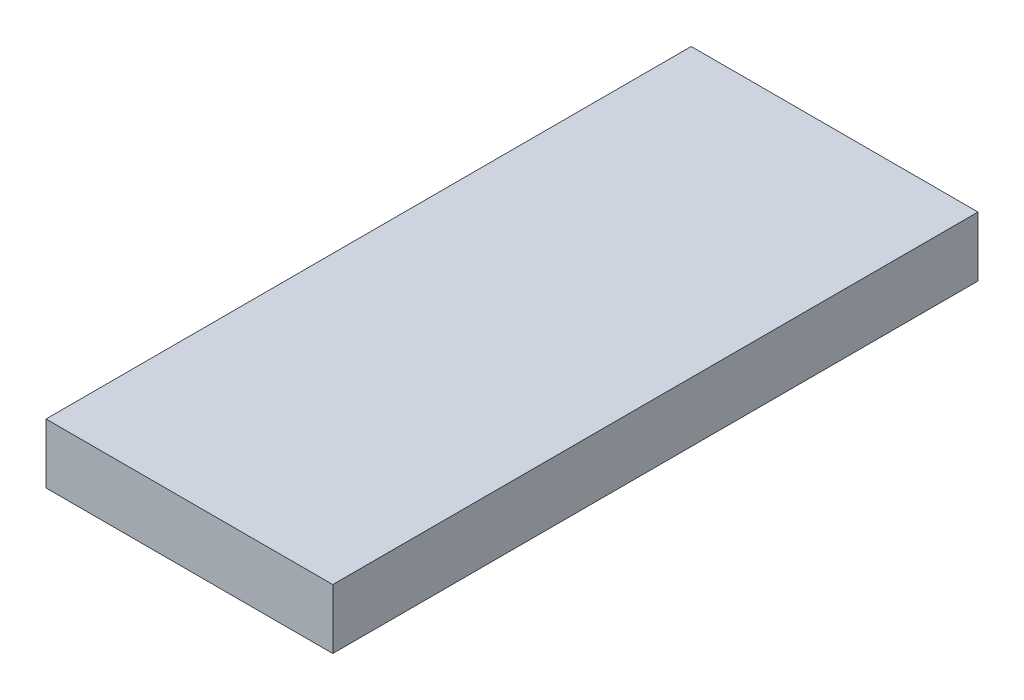
ISO-10303-21;
HEADER;
FILE_DESCRIPTION(('STEP AP214'),'2;1');
FILE_NAME('part.step','',(''),(''),'','','');
FILE_SCHEMA(('AUTOMOTIVE_DESIGN { 1 0 10303 214 1 1 1 1 }'));
ENDSEC;
DATA;
#1=APPLICATION_CONTEXT('core data for automotive mechanical design processes');
#2=APPLICATION_PROTOCOL_DEFINITION('international standard','automotive_design',2000,#1);
#3=PRODUCT_CONTEXT('',#1,'mechanical');
#4=PRODUCT('Part','Part','',(#3));
#5=PRODUCT_RELATED_PRODUCT_CATEGORY('part','',(#4));
#6=PRODUCT_DEFINITION_FORMATION('','',#4);
#7=PRODUCT_DEFINITION_CONTEXT('part definition',#1,'design');
#8=PRODUCT_DEFINITION('design','',#6,#7);
#9=PRODUCT_DEFINITION_SHAPE('','',#8);
#10=(LENGTH_UNIT() NAMED_UNIT(*) SI_UNIT(.MILLI.,.METRE.));
#11=(NAMED_UNIT(*) PLANE_ANGLE_UNIT() SI_UNIT($,.RADIAN.));
#12=(NAMED_UNIT(*) SI_UNIT($,.STERADIAN.) SOLID_ANGLE_UNIT());
#13=UNCERTAINTY_MEASURE_WITH_UNIT(LENGTH_MEASURE(1.E-05),#10,'distance_accuracy_value','');
#14=(GEOMETRIC_REPRESENTATION_CONTEXT(3) GLOBAL_UNCERTAINTY_ASSIGNED_CONTEXT((#13)) GLOBAL_UNIT_ASSIGNED_CONTEXT((#10,
#11,#12)) REPRESENTATION_CONTEXT('',''));
#15=CARTESIAN_POINT('',(0.,0.,0.));
#16=DIRECTION('',(0.,0.,1.));
#17=DIRECTION('',(1.,0.,0.));
#18=AXIS2_PLACEMENT_3D('',#15,#16,#17);
#19=CARTESIAN_POINT('',(-12.,5.,27.));
#20=DIRECTION('',(1.,0.,0.));
#21=DIRECTION('',(0.,0.,-1.));
#22=AXIS2_PLACEMENT_3D('',#19,#20,#21);
#23=PLANE('',#22);
#24=DIRECTION('',(0.,0.,1.));
#25=VECTOR('',#24,1.);
#26=CARTESIAN_POINT('',(-12.,0.,27.));
#27=LINE('',#26,#25);
#28=CARTESIAN_POINT('',(-12.,0.,-27.));
#29=VERTEX_POINT('',#28);
#30=CARTESIAN_POINT('',(-12.,0.,27.));
#31=VERTEX_POINT('',#30);
#32=EDGE_CURVE('E100',#29,#31,#27,.T.);
#33=ORIENTED_EDGE('',*,*,#32,.T.);
#34=DIRECTION('',(0.,-1.,0.));
#35=VECTOR('',#34,1.);
#36=CARTESIAN_POINT('',(-12.,5.,27.));
#37=LINE('',#36,#35);
#38=CARTESIAN_POINT('',(-12.,5.,27.));
#39=VERTEX_POINT('',#38);
#40=EDGE_CURVE('E11',#39,#31,#37,.T.);
#41=ORIENTED_EDGE('',*,*,#40,.F.);
#42=DIRECTION('',(0.,0.,1.));
#43=VECTOR('',#42,1.);
#44=CARTESIAN_POINT('',(-12.,5.,27.));
#45=LINE('',#44,#43);
#46=CARTESIAN_POINT('',(-12.,5.,-27.));
#47=VERTEX_POINT('',#46);
#48=EDGE_CURVE('E88',#47,#39,#45,.T.);
#49=ORIENTED_EDGE('',*,*,#48,.F.);
#50=DIRECTION('',(0.,-1.,0.));
#51=VECTOR('',#50,1.);
#52=CARTESIAN_POINT('',(-12.,5.,-27.));
#53=LINE('',#52,#51);
#54=EDGE_CURVE('E96',#47,#29,#53,.T.);
#55=ORIENTED_EDGE('',*,*,#54,.T.);
#56=EDGE_LOOP('',(#33,#41,#49,#55));
#57=FACE_BOUND('',#56,.T.);
#58=ADVANCED_FACE('F37',(#57),#23,.F.);
#59=CARTESIAN_POINT('',(12.,5.,27.));
#60=DIRECTION('',(0.,0.,-1.));
#61=DIRECTION('',(-1.,0.,0.));
#62=AXIS2_PLACEMENT_3D('',#59,#60,#61);
#63=PLANE('',#62);
#64=DIRECTION('',(1.,0.,0.));
#65=VECTOR('',#64,1.);
#66=CARTESIAN_POINT('',(12.,0.,27.));
#67=LINE('',#66,#65);
#68=CARTESIAN_POINT('',(12.,0.,27.));
#69=VERTEX_POINT('',#68);
#70=EDGE_CURVE('E92',#31,#69,#67,.T.);
#71=ORIENTED_EDGE('',*,*,#70,.T.);
#72=DIRECTION('',(0.,-1.,0.));
#73=VECTOR('',#72,1.);
#74=CARTESIAN_POINT('',(12.,5.,27.));
#75=LINE('',#74,#73);
#76=CARTESIAN_POINT('',(12.,5.,27.));
#77=VERTEX_POINT('',#76);
#78=EDGE_CURVE('E45',#77,#69,#75,.T.);
#79=ORIENTED_EDGE('',*,*,#78,.F.);
#80=DIRECTION('',(1.,0.,0.));
#81=VECTOR('',#80,1.);
#82=CARTESIAN_POINT('',(12.,5.,27.));
#83=LINE('',#82,#81);
#84=EDGE_CURVE('E83',#39,#77,#83,.T.);
#85=ORIENTED_EDGE('',*,*,#84,.F.);
#86=ORIENTED_EDGE('',*,*,#40,.T.);
#87=EDGE_LOOP('',(#71,#79,#85,#86));
#88=FACE_BOUND('',#87,.T.);
#89=ADVANCED_FACE('F91',(#88),#63,.F.);
#90=CARTESIAN_POINT('',(12.,5.,27.));
#91=DIRECTION('',(-1.,0.,0.));
#92=DIRECTION('',(0.,0.,1.));
#93=AXIS2_PLACEMENT_3D('',#90,#91,#92);
#94=PLANE('',#93);
#95=DIRECTION('',(0.,0.,-1.));
#96=VECTOR('',#95,1.);
#97=CARTESIAN_POINT('',(12.,0.,27.));
#98=LINE('',#97,#96);
#99=CARTESIAN_POINT('',(12.,0.,-27.));
#100=VERTEX_POINT('',#99);
#101=EDGE_CURVE('E70',#69,#100,#98,.T.);
#102=ORIENTED_EDGE('',*,*,#101,.T.);
#103=DIRECTION('',(0.,-1.,0.));
#104=VECTOR('',#103,1.);
#105=CARTESIAN_POINT('',(12.,5.,-27.));
#106=LINE('',#105,#104);
#107=CARTESIAN_POINT('',(12.,5.,-27.));
#108=VERTEX_POINT('',#107);
#109=EDGE_CURVE('E93',#108,#100,#106,.T.);
#110=ORIENTED_EDGE('',*,*,#109,.F.);
#111=DIRECTION('',(0.,0.,-1.));
#112=VECTOR('',#111,1.);
#113=CARTESIAN_POINT('',(12.,5.,27.));
#114=LINE('',#113,#112);
#115=EDGE_CURVE('E86',#77,#108,#114,.T.);
#116=ORIENTED_EDGE('',*,*,#115,.F.);
#117=ORIENTED_EDGE('',*,*,#78,.T.);
#118=EDGE_LOOP('',(#102,#110,#116,#117));
#119=FACE_BOUND('',#118,.T.);
#120=ADVANCED_FACE('F94',(#119),#94,.F.);
#121=CARTESIAN_POINT('',(12.,5.,-27.));
#122=DIRECTION('',(0.,0.,1.));
#123=DIRECTION('',(1.,0.,0.));
#124=AXIS2_PLACEMENT_3D('',#121,#122,#123);
#125=PLANE('',#124);
#126=DIRECTION('',(-1.,0.,0.));
#127=VECTOR('',#126,1.);
#128=CARTESIAN_POINT('',(12.,0.,-27.));
#129=LINE('',#128,#127);
#130=EDGE_CURVE('E76',#100,#29,#129,.T.);
#131=ORIENTED_EDGE('',*,*,#130,.T.);
#132=ORIENTED_EDGE('',*,*,#54,.F.);
#133=DIRECTION('',(-1.,0.,0.));
#134=VECTOR('',#133,1.);
#135=CARTESIAN_POINT('',(12.,5.,-27.));
#136=LINE('',#135,#134);
#137=EDGE_CURVE('E53',#108,#47,#136,.T.);
#138=ORIENTED_EDGE('',*,*,#137,.F.);
#139=ORIENTED_EDGE('',*,*,#109,.T.);
#140=EDGE_LOOP('',(#131,#132,#138,#139));
#141=FACE_BOUND('',#140,.T.);
#142=ADVANCED_FACE('F107',(#141),#125,.F.);
#143=CARTESIAN_POINT('',(0.,5.,0.));
#144=DIRECTION('',(0.,1.,0.));
#145=DIRECTION('',(0.,0.,1.));
#146=AXIS2_PLACEMENT_3D('',#143,#144,#145);
#147=PLANE('',#146);
#148=ORIENTED_EDGE('',*,*,#48,.T.);
#149=ORIENTED_EDGE('',*,*,#84,.T.);
#150=ORIENTED_EDGE('',*,*,#115,.T.);
#151=ORIENTED_EDGE('',*,*,#137,.T.);
#152=EDGE_LOOP('',(#148,#149,#150,#151));
#153=FACE_BOUND('',#152,.T.);
#154=ADVANCED_FACE('F84',(#153),#147,.T.);
#155=CARTESIAN_POINT('',(0.,0.,0.));
#156=DIRECTION('',(0.,1.,0.));
#157=DIRECTION('',(0.,0.,1.));
#158=AXIS2_PLACEMENT_3D('',#155,#156,#157);
#159=PLANE('',#158);
#160=ORIENTED_EDGE('',*,*,#32,.F.);
#161=ORIENTED_EDGE('',*,*,#130,.F.);
#162=ORIENTED_EDGE('',*,*,#101,.F.);
#163=ORIENTED_EDGE('',*,*,#70,.F.);
#164=EDGE_LOOP('',(#160,#161,#162,#163));
#165=FACE_BOUND('',#164,.T.);
#166=ADVANCED_FACE('F110',(#165),#159,.F.);
#167=CLOSED_SHELL('',(#58,#89,#120,#142,#154,#166));
#168=MANIFOLD_SOLID_BREP('B2',#167);
#169=ADVANCED_BREP_SHAPE_REPRESENTATION('',(#18,#168),#14);
#170=SHAPE_DEFINITION_REPRESENTATION(#9,#169);
ENDSEC;
END-ISO-10303-21;
